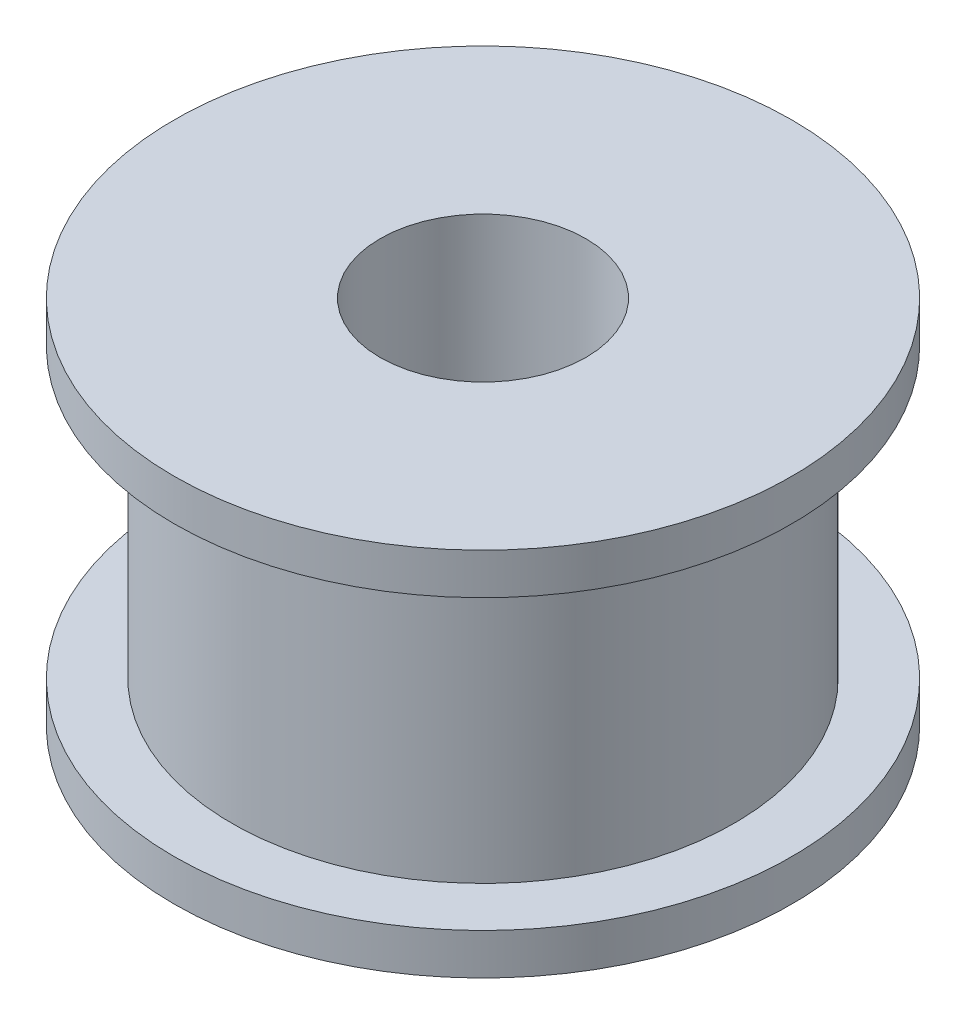
ISO-10303-21;
HEADER;
FILE_DESCRIPTION(('STEP AP214'),'2;1');
FILE_NAME('part.step','',(''),(''),'','','');
FILE_SCHEMA(('AUTOMOTIVE_DESIGN { 1 0 10303 214 1 1 1 1 }'));
ENDSEC;
DATA;
#1=APPLICATION_CONTEXT('core data for automotive mechanical design processes');
#2=APPLICATION_PROTOCOL_DEFINITION('international standard','automotive_design',2000,#1);
#3=PRODUCT_CONTEXT('',#1,'mechanical');
#4=PRODUCT('Part','Part','',(#3));
#5=PRODUCT_RELATED_PRODUCT_CATEGORY('part','',(#4));
#6=PRODUCT_DEFINITION_FORMATION('','',#4);
#7=PRODUCT_DEFINITION_CONTEXT('part definition',#1,'design');
#8=PRODUCT_DEFINITION('design','',#6,#7);
#9=PRODUCT_DEFINITION_SHAPE('','',#8);
#10=(LENGTH_UNIT() NAMED_UNIT(*) SI_UNIT(.MILLI.,.METRE.));
#11=(NAMED_UNIT(*) PLANE_ANGLE_UNIT() SI_UNIT($,.RADIAN.));
#12=(NAMED_UNIT(*) SI_UNIT($,.STERADIAN.) SOLID_ANGLE_UNIT());
#13=UNCERTAINTY_MEASURE_WITH_UNIT(LENGTH_MEASURE(1.E-05),#10,'distance_accuracy_value','');
#14=(GEOMETRIC_REPRESENTATION_CONTEXT(3) GLOBAL_UNCERTAINTY_ASSIGNED_CONTEXT((#13)) GLOBAL_UNIT_ASSIGNED_CONTEXT((#10,
#11,#12)) REPRESENTATION_CONTEXT('',''));
#15=CARTESIAN_POINT('',(0.,0.,0.));
#16=DIRECTION('',(0.,0.,1.));
#17=DIRECTION('',(1.,0.,0.));
#18=AXIS2_PLACEMENT_3D('',#15,#16,#17);
#19=CARTESIAN_POINT('',(0.,0.,0.));
#20=DIRECTION('',(0.,1.,0.));
#21=DIRECTION('',(0.,0.,1.));
#22=AXIS2_PLACEMENT_3D('',#19,#20,#21);
#23=PLANE('',#22);
#24=CARTESIAN_POINT('',(0.,0.,0.));
#25=DIRECTION('',(0.,1.,0.));
#26=DIRECTION('',(0.,0.,1.));
#27=AXIS2_PLACEMENT_3D('',#24,#25,#26);
#28=CIRCLE('',#27,2.5);
#29=CARTESIAN_POINT('',(0.,0.,2.5));
#30=VERTEX_POINT('',#29);
#31=EDGE_CURVE('E56',#30,#30,#28,.T.);
#32=ORIENTED_EDGE('',*,*,#31,.F.);
#33=EDGE_LOOP('',(#32));
#34=FACE_BOUND('',#33,.T.);
#35=CARTESIAN_POINT('',(0.,0.,0.));
#36=DIRECTION('',(0.,-1.,0.));
#37=DIRECTION('',(0.,0.,-1.));
#38=AXIS2_PLACEMENT_3D('',#35,#36,#37);
#39=CIRCLE('',#38,7.5);
#40=CARTESIAN_POINT('',(0.,0.,-7.5));
#41=VERTEX_POINT('',#40);
#42=EDGE_CURVE('E10',#41,#41,#39,.T.);
#43=ORIENTED_EDGE('',*,*,#42,.F.);
#44=EDGE_LOOP('',(#43));
#45=FACE_BOUND('',#44,.T.);
#46=ADVANCED_FACE('F31',(#34,#45),#23,.T.);
#47=CARTESIAN_POINT('',(0.,3.04,0.));
#48=DIRECTION('',(0.,-1.,0.));
#49=DIRECTION('',(0.,0.,-1.));
#50=AXIS2_PLACEMENT_3D('',#47,#48,#49);
#51=CYLINDRICAL_SURFACE('',#50,7.5);
#52=ORIENTED_EDGE('',*,*,#42,.T.);
#53=EDGE_LOOP('',(#52));
#54=FACE_BOUND('',#53,.T.);
#55=CARTESIAN_POINT('',(0.,-1.,0.));
#56=DIRECTION('',(0.,-1.,0.));
#57=DIRECTION('',(0.,0.,-1.));
#58=AXIS2_PLACEMENT_3D('',#55,#56,#57);
#59=CIRCLE('',#58,7.5);
#60=CARTESIAN_POINT('',(0.,-1.,-7.5));
#61=VERTEX_POINT('',#60);
#62=EDGE_CURVE('E38',#61,#61,#59,.T.);
#63=ORIENTED_EDGE('',*,*,#62,.F.);
#64=EDGE_LOOP('',(#63));
#65=FACE_BOUND('',#64,.T.);
#66=ADVANCED_FACE('F83',(#54,#65),#51,.T.);
#67=CARTESIAN_POINT('',(7.5,-1.,0.));
#68=DIRECTION('',(0.,-1.,0.));
#69=DIRECTION('',(0.,0.,-1.));
#70=AXIS2_PLACEMENT_3D('',#67,#68,#69);
#71=PLANE('',#70);
#72=ORIENTED_EDGE('',*,*,#62,.T.);
#73=EDGE_LOOP('',(#72));
#74=FACE_BOUND('',#73,.T.);
#75=CARTESIAN_POINT('',(0.,-1.,0.));
#76=DIRECTION('',(0.,-1.,0.));
#77=DIRECTION('',(0.,0.,-1.));
#78=AXIS2_PLACEMENT_3D('',#75,#76,#77);
#79=CIRCLE('',#78,6.1);
#80=CARTESIAN_POINT('',(0.,-1.,-6.1));
#81=VERTEX_POINT('',#80);
#82=EDGE_CURVE('E42',#81,#81,#79,.T.);
#83=ORIENTED_EDGE('',*,*,#82,.F.);
#84=EDGE_LOOP('',(#83));
#85=FACE_BOUND('',#84,.T.);
#86=ADVANCED_FACE('F88',(#74,#85),#71,.T.);
#87=CARTESIAN_POINT('',(0.,3.04,0.));
#88=DIRECTION('',(0.,-1.,0.));
#89=DIRECTION('',(0.,0.,-1.));
#90=AXIS2_PLACEMENT_3D('',#87,#88,#89);
#91=CYLINDRICAL_SURFACE('',#90,6.1);
#92=ORIENTED_EDGE('',*,*,#82,.T.);
#93=EDGE_LOOP('',(#92));
#94=FACE_BOUND('',#93,.T.);
#95=CARTESIAN_POINT('',(0.,-8.,0.));
#96=DIRECTION('',(0.,-1.,0.));
#97=DIRECTION('',(0.,0.,-1.));
#98=AXIS2_PLACEMENT_3D('',#95,#96,#97);
#99=CIRCLE('',#98,6.1);
#100=CARTESIAN_POINT('',(0.,-8.,-6.1));
#101=VERTEX_POINT('',#100);
#102=EDGE_CURVE('E47',#101,#101,#99,.T.);
#103=ORIENTED_EDGE('',*,*,#102,.F.);
#104=EDGE_LOOP('',(#103));
#105=FACE_BOUND('',#104,.T.);
#106=ADVANCED_FACE('F79',(#94,#105),#91,.T.);
#107=CARTESIAN_POINT('',(6.1,-8.,0.));
#108=DIRECTION('',(0.,1.,0.));
#109=DIRECTION('',(0.,0.,1.));
#110=AXIS2_PLACEMENT_3D('',#107,#108,#109);
#111=PLANE('',#110);
#112=ORIENTED_EDGE('',*,*,#102,.T.);
#113=EDGE_LOOP('',(#112));
#114=FACE_BOUND('',#113,.T.);
#115=CARTESIAN_POINT('',(0.,-8.,0.));
#116=DIRECTION('',(0.,-1.,0.));
#117=DIRECTION('',(0.,0.,-1.));
#118=AXIS2_PLACEMENT_3D('',#115,#116,#117);
#119=CIRCLE('',#118,7.5);
#120=CARTESIAN_POINT('',(0.,-8.,-7.5));
#121=VERTEX_POINT('',#120);
#122=EDGE_CURVE('E50',#121,#121,#119,.T.);
#123=ORIENTED_EDGE('',*,*,#122,.F.);
#124=EDGE_LOOP('',(#123));
#125=FACE_BOUND('',#124,.T.);
#126=ADVANCED_FACE('F73',(#114,#125),#111,.T.);
#127=CARTESIAN_POINT('',(0.,3.04,0.));
#128=DIRECTION('',(0.,-1.,0.));
#129=DIRECTION('',(0.,0.,-1.));
#130=AXIS2_PLACEMENT_3D('',#127,#128,#129);
#131=CYLINDRICAL_SURFACE('',#130,7.5);
#132=ORIENTED_EDGE('',*,*,#122,.T.);
#133=EDGE_LOOP('',(#132));
#134=FACE_BOUND('',#133,.T.);
#135=CARTESIAN_POINT('',(0.,-9.,0.));
#136=DIRECTION('',(0.,-1.,0.));
#137=DIRECTION('',(0.,0.,-1.));
#138=AXIS2_PLACEMENT_3D('',#135,#136,#137);
#139=CIRCLE('',#138,7.5);
#140=CARTESIAN_POINT('',(0.,-9.,-7.5));
#141=VERTEX_POINT('',#140);
#142=EDGE_CURVE('E53',#141,#141,#139,.T.);
#143=ORIENTED_EDGE('',*,*,#142,.F.);
#144=EDGE_LOOP('',(#143));
#145=FACE_BOUND('',#144,.T.);
#146=ADVANCED_FACE('F68',(#134,#145),#131,.T.);
#147=CARTESIAN_POINT('',(7.5,-9.,0.));
#148=DIRECTION('',(0.,-1.,0.));
#149=DIRECTION('',(0.,0.,-1.));
#150=AXIS2_PLACEMENT_3D('',#147,#148,#149);
#151=PLANE('',#150);
#152=CARTESIAN_POINT('',(0.,-9.,0.));
#153=DIRECTION('',(0.,-1.,0.));
#154=DIRECTION('',(0.,0.,-1.));
#155=AXIS2_PLACEMENT_3D('',#152,#153,#154);
#156=CIRCLE('',#155,2.5);
#157=CARTESIAN_POINT('',(0.,-9.,-2.5));
#158=VERTEX_POINT('',#157);
#159=EDGE_CURVE('E34',#158,#158,#156,.T.);
#160=ORIENTED_EDGE('',*,*,#159,.F.);
#161=EDGE_LOOP('',(#160));
#162=FACE_BOUND('',#161,.T.);
#163=ORIENTED_EDGE('',*,*,#142,.T.);
#164=EDGE_LOOP('',(#163));
#165=FACE_BOUND('',#164,.T.);
#166=ADVANCED_FACE('F65',(#162,#165),#151,.T.);
#167=CARTESIAN_POINT('',(0.,-10.,0.));
#168=DIRECTION('',(0.,1.,0.));
#169=DIRECTION('',(0.,0.,1.));
#170=AXIS2_PLACEMENT_3D('',#167,#168,#169);
#171=CYLINDRICAL_SURFACE('',#170,2.5);
#172=ORIENTED_EDGE('',*,*,#159,.T.);
#173=EDGE_LOOP('',(#172));
#174=FACE_BOUND('',#173,.T.);
#175=ORIENTED_EDGE('',*,*,#31,.T.);
#176=EDGE_LOOP('',(#175));
#177=FACE_BOUND('',#176,.T.);
#178=ADVANCED_FACE('F63',(#174,#177),#171,.F.);
#179=CLOSED_SHELL('',(#46,#66,#86,#106,#126,#146,#166,#178));
#180=MANIFOLD_SOLID_BREP('B2',#179);
#181=ADVANCED_BREP_SHAPE_REPRESENTATION('',(#18,#180),#14);
#182=SHAPE_DEFINITION_REPRESENTATION(#9,#181);
ENDSEC;
END-ISO-10303-21;
